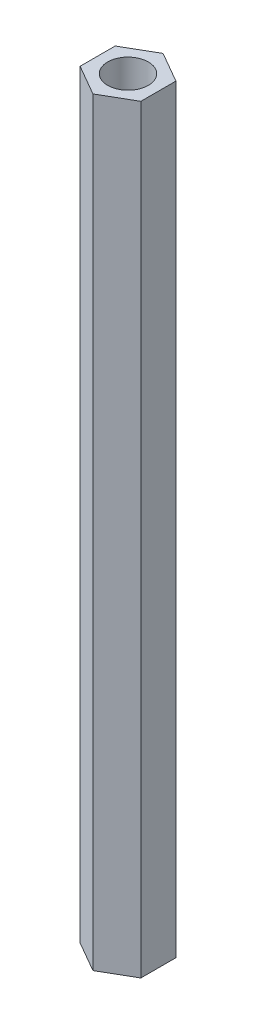
ISO-10303-21;
HEADER;
FILE_DESCRIPTION(('STEP AP214'),'2;1');
FILE_NAME('part.step','',(''),(''),'','','');
FILE_SCHEMA(('AUTOMOTIVE_DESIGN { 1 0 10303 214 1 1 1 1 }'));
ENDSEC;
DATA;
#1=APPLICATION_CONTEXT('core data for automotive mechanical design processes');
#2=APPLICATION_PROTOCOL_DEFINITION('international standard','automotive_design',2000,#1);
#3=PRODUCT_CONTEXT('',#1,'mechanical');
#4=PRODUCT('Part','Part','',(#3));
#5=PRODUCT_RELATED_PRODUCT_CATEGORY('part','',(#4));
#6=PRODUCT_DEFINITION_FORMATION('','',#4);
#7=PRODUCT_DEFINITION_CONTEXT('part definition',#1,'design');
#8=PRODUCT_DEFINITION('design','',#6,#7);
#9=PRODUCT_DEFINITION_SHAPE('','',#8);
#10=(LENGTH_UNIT() NAMED_UNIT(*) SI_UNIT(.MILLI.,.METRE.));
#11=(NAMED_UNIT(*) PLANE_ANGLE_UNIT() SI_UNIT($,.RADIAN.));
#12=(NAMED_UNIT(*) SI_UNIT($,.STERADIAN.) SOLID_ANGLE_UNIT());
#13=UNCERTAINTY_MEASURE_WITH_UNIT(LENGTH_MEASURE(1.E-05),#10,'distance_accuracy_value','');
#14=(GEOMETRIC_REPRESENTATION_CONTEXT(3) GLOBAL_UNCERTAINTY_ASSIGNED_CONTEXT((#13)) GLOBAL_UNIT_ASSIGNED_CONTEXT((#10,
#11,#12)) REPRESENTATION_CONTEXT('',''));
#15=CARTESIAN_POINT('',(0.,0.,0.));
#16=DIRECTION('',(0.,0.,1.));
#17=DIRECTION('',(1.,0.,0.));
#18=AXIS2_PLACEMENT_3D('',#15,#16,#17);
#19=CARTESIAN_POINT('',(0.,44.45,0.));
#20=DIRECTION('',(0.,1.,0.));
#21=DIRECTION('',(0.,0.,1.));
#22=AXIS2_PLACEMENT_3D('',#19,#20,#21);
#23=PLANE('',#22);
#24=DIRECTION('',(0.866025403784438,0.,0.5));
#25=VECTOR('',#24,1.);
#26=CARTESIAN_POINT('',(-1.778,44.45,1.02652877861915));
#27=LINE('',#26,#25);
#28=CARTESIAN_POINT('',(-1.778,44.45,1.02652877861915));
#29=VERTEX_POINT('',#28);
#30=CARTESIAN_POINT('',(0.,44.45,2.05305755723831));
#31=VERTEX_POINT('',#30);
#32=EDGE_CURVE('E129',#29,#31,#27,.T.);
#33=ORIENTED_EDGE('',*,*,#32,.T.);
#34=DIRECTION('',(0.866025403784439,0.,-0.5));
#35=VECTOR('',#34,1.);
#36=CARTESIAN_POINT('',(0.,44.45,2.05305755723831));
#37=LINE('',#36,#35);
#38=CARTESIAN_POINT('',(1.778,44.45,1.02652877861915));
#39=VERTEX_POINT('',#38);
#40=EDGE_CURVE('E87',#31,#39,#37,.T.);
#41=ORIENTED_EDGE('',*,*,#40,.T.);
#42=DIRECTION('',(0.,0.,-1.));
#43=VECTOR('',#42,1.);
#44=CARTESIAN_POINT('',(1.778,44.45,1.02652877861915));
#45=LINE('',#44,#43);
#46=CARTESIAN_POINT('',(1.778,44.45,-1.02652877861915));
#47=VERTEX_POINT('',#46);
#48=EDGE_CURVE('E100',#39,#47,#45,.T.);
#49=ORIENTED_EDGE('',*,*,#48,.T.);
#50=DIRECTION('',(-0.866025403784439,0.,-0.5));
#51=VECTOR('',#50,1.);
#52=CARTESIAN_POINT('',(1.778,44.45,-1.02652877861915));
#53=LINE('',#52,#51);
#54=CARTESIAN_POINT('',(0.,44.45,-2.05305755723831));
#55=VERTEX_POINT('',#54);
#56=EDGE_CURVE('E94',#47,#55,#53,.T.);
#57=ORIENTED_EDGE('',*,*,#56,.T.);
#58=DIRECTION('',(-0.866025403784439,0.,0.5));
#59=VECTOR('',#58,1.);
#60=CARTESIAN_POINT('',(0.,44.45,-2.05305755723831));
#61=LINE('',#60,#59);
#62=CARTESIAN_POINT('',(-1.778,44.45,-1.02652877861915));
#63=VERTEX_POINT('',#62);
#64=EDGE_CURVE('E98',#55,#63,#61,.T.);
#65=ORIENTED_EDGE('',*,*,#64,.T.);
#66=DIRECTION('',(0.,0.,1.));
#67=VECTOR('',#66,1.);
#68=CARTESIAN_POINT('',(-1.778,44.45,-1.02652877861915));
#69=LINE('',#68,#67);
#70=EDGE_CURVE('E50',#63,#29,#69,.T.);
#71=ORIENTED_EDGE('',*,*,#70,.T.);
#72=EDGE_LOOP('',(#33,#41,#49,#57,#65,#71));
#73=FACE_BOUND('',#72,.T.);
#74=CARTESIAN_POINT('',(0.,44.45,0.));
#75=DIRECTION('',(0.,1.,0.));
#76=DIRECTION('',(0.,0.,1.));
#77=AXIS2_PLACEMENT_3D('',#74,#75,#76);
#78=CIRCLE('',#77,1.190625);
#79=CARTESIAN_POINT('',(0.,44.45,1.190625));
#80=VERTEX_POINT('',#79);
#81=EDGE_CURVE('E122',#80,#80,#78,.T.);
#82=ORIENTED_EDGE('',*,*,#81,.F.);
#83=EDGE_LOOP('',(#82));
#84=FACE_BOUND('',#83,.T.);
#85=ADVANCED_FACE('F33',(#73,#84),#23,.T.);
#86=CARTESIAN_POINT('',(0.,0.,0.));
#87=DIRECTION('',(0.,1.,0.));
#88=DIRECTION('',(0.,0.,1.));
#89=AXIS2_PLACEMENT_3D('',#86,#87,#88);
#90=PLANE('',#89);
#91=DIRECTION('',(0.866025403784438,0.,0.5));
#92=VECTOR('',#91,1.);
#93=CARTESIAN_POINT('',(-1.778,0.,1.02652877861915));
#94=LINE('',#93,#92);
#95=CARTESIAN_POINT('',(-1.778,0.,1.02652877861915));
#96=VERTEX_POINT('',#95);
#97=CARTESIAN_POINT('',(0.,0.,2.05305755723831));
#98=VERTEX_POINT('',#97);
#99=EDGE_CURVE('E118',#96,#98,#94,.T.);
#100=ORIENTED_EDGE('',*,*,#99,.F.);
#101=DIRECTION('',(0.,0.,1.));
#102=VECTOR('',#101,1.);
#103=CARTESIAN_POINT('',(-1.778,0.,-1.02652877861915));
#104=LINE('',#103,#102);
#105=CARTESIAN_POINT('',(-1.778,0.,-1.02652877861915));
#106=VERTEX_POINT('',#105);
#107=EDGE_CURVE('E79',#106,#96,#104,.T.);
#108=ORIENTED_EDGE('',*,*,#107,.F.);
#109=DIRECTION('',(-0.866025403784439,0.,0.5));
#110=VECTOR('',#109,1.);
#111=CARTESIAN_POINT('',(0.,0.,-2.05305755723831));
#112=LINE('',#111,#110);
#113=CARTESIAN_POINT('',(0.,0.,-2.05305755723831));
#114=VERTEX_POINT('',#113);
#115=EDGE_CURVE('E73',#114,#106,#112,.T.);
#116=ORIENTED_EDGE('',*,*,#115,.F.);
#117=DIRECTION('',(-0.866025403784439,0.,-0.5));
#118=VECTOR('',#117,1.);
#119=CARTESIAN_POINT('',(1.778,0.,-1.02652877861915));
#120=LINE('',#119,#118);
#121=CARTESIAN_POINT('',(1.778,0.,-1.02652877861915));
#122=VERTEX_POINT('',#121);
#123=EDGE_CURVE('E108',#122,#114,#120,.T.);
#124=ORIENTED_EDGE('',*,*,#123,.F.);
#125=DIRECTION('',(0.,0.,-1.));
#126=VECTOR('',#125,1.);
#127=CARTESIAN_POINT('',(1.778,0.,1.02652877861915));
#128=LINE('',#127,#126);
#129=CARTESIAN_POINT('',(1.778,0.,1.02652877861915));
#130=VERTEX_POINT('',#129);
#131=EDGE_CURVE('E124',#130,#122,#128,.T.);
#132=ORIENTED_EDGE('',*,*,#131,.F.);
#133=DIRECTION('',(0.866025403784439,0.,-0.5));
#134=VECTOR('',#133,1.);
#135=CARTESIAN_POINT('',(0.,0.,2.05305755723831));
#136=LINE('',#135,#134);
#137=EDGE_CURVE('E121',#98,#130,#136,.T.);
#138=ORIENTED_EDGE('',*,*,#137,.F.);
#139=EDGE_LOOP('',(#100,#108,#116,#124,#132,#138));
#140=FACE_BOUND('',#139,.T.);
#141=CARTESIAN_POINT('',(0.,0.,0.));
#142=DIRECTION('',(0.,1.,0.));
#143=DIRECTION('',(0.,0.,1.));
#144=AXIS2_PLACEMENT_3D('',#141,#142,#143);
#145=CIRCLE('',#144,1.190625);
#146=CARTESIAN_POINT('',(0.,0.,1.190625));
#147=VERTEX_POINT('',#146);
#148=EDGE_CURVE('E222',#147,#147,#145,.T.);
#149=ORIENTED_EDGE('',*,*,#148,.T.);
#150=EDGE_LOOP('',(#149));
#151=FACE_BOUND('',#150,.T.);
#152=ADVANCED_FACE('F138',(#140,#151),#90,.F.);
#153=CARTESIAN_POINT('',(-1.778,44.45,1.02652877861915));
#154=DIRECTION('',(0.5,0.,-0.866025403784439));
#155=DIRECTION('',(-0.866025403784439,0.,-0.5));
#156=AXIS2_PLACEMENT_3D('',#153,#154,#155);
#157=PLANE('',#156);
#158=ORIENTED_EDGE('',*,*,#99,.T.);
#159=DIRECTION('',(0.,-1.,0.));
#160=VECTOR('',#159,1.);
#161=CARTESIAN_POINT('',(0.,44.45,2.05305755723831));
#162=LINE('',#161,#160);
#163=EDGE_CURVE('E11',#31,#98,#162,.T.);
#164=ORIENTED_EDGE('',*,*,#163,.F.);
#165=ORIENTED_EDGE('',*,*,#32,.F.);
#166=DIRECTION('',(0.,-1.,0.));
#167=VECTOR('',#166,1.);
#168=CARTESIAN_POINT('',(-1.778,44.45,1.02652877861915));
#169=LINE('',#168,#167);
#170=EDGE_CURVE('E114',#29,#96,#169,.T.);
#171=ORIENTED_EDGE('',*,*,#170,.T.);
#172=EDGE_LOOP('',(#158,#164,#165,#171));
#173=FACE_BOUND('',#172,.T.);
#174=ADVANCED_FACE('F35',(#173),#157,.F.);
#175=CARTESIAN_POINT('',(0.,44.45,2.05305755723831));
#176=DIRECTION('',(-0.5,0.,-0.866025403784439));
#177=DIRECTION('',(-0.866025403784439,0.,0.5));
#178=AXIS2_PLACEMENT_3D('',#175,#176,#177);
#179=PLANE('',#178);
#180=ORIENTED_EDGE('',*,*,#137,.T.);
#181=DIRECTION('',(0.,-1.,0.));
#182=VECTOR('',#181,1.);
#183=CARTESIAN_POINT('',(1.778,44.45,1.02652877861915));
#184=LINE('',#183,#182);
#185=EDGE_CURVE('E42',#39,#130,#184,.T.);
#186=ORIENTED_EDGE('',*,*,#185,.F.);
#187=ORIENTED_EDGE('',*,*,#40,.F.);
#188=ORIENTED_EDGE('',*,*,#163,.T.);
#189=EDGE_LOOP('',(#180,#186,#187,#188));
#190=FACE_BOUND('',#189,.T.);
#191=ADVANCED_FACE('F163',(#190),#179,.F.);
#192=CARTESIAN_POINT('',(1.778,44.45,1.02652877861915));
#193=DIRECTION('',(-1.,0.,0.));
#194=DIRECTION('',(0.,0.,1.));
#195=AXIS2_PLACEMENT_3D('',#192,#193,#194);
#196=PLANE('',#195);
#197=ORIENTED_EDGE('',*,*,#131,.T.);
#198=DIRECTION('',(0.,-1.,0.));
#199=VECTOR('',#198,1.);
#200=CARTESIAN_POINT('',(1.778,44.45,-1.02652877861915));
#201=LINE('',#200,#199);
#202=EDGE_CURVE('E109',#47,#122,#201,.T.);
#203=ORIENTED_EDGE('',*,*,#202,.F.);
#204=ORIENTED_EDGE('',*,*,#48,.F.);
#205=ORIENTED_EDGE('',*,*,#185,.T.);
#206=EDGE_LOOP('',(#197,#203,#204,#205));
#207=FACE_BOUND('',#206,.T.);
#208=ADVANCED_FACE('F135',(#207),#196,.F.);
#209=CARTESIAN_POINT('',(1.778,44.45,-1.02652877861915));
#210=DIRECTION('',(-0.5,0.,0.866025403784439));
#211=DIRECTION('',(0.866025403784439,0.,0.5));
#212=AXIS2_PLACEMENT_3D('',#209,#210,#211);
#213=PLANE('',#212);
#214=ORIENTED_EDGE('',*,*,#123,.T.);
#215=DIRECTION('',(0.,-1.,0.));
#216=VECTOR('',#215,1.);
#217=CARTESIAN_POINT('',(0.,44.45,-2.05305755723831));
#218=LINE('',#217,#216);
#219=EDGE_CURVE('E105',#55,#114,#218,.T.);
#220=ORIENTED_EDGE('',*,*,#219,.F.);
#221=ORIENTED_EDGE('',*,*,#56,.F.);
#222=ORIENTED_EDGE('',*,*,#202,.T.);
#223=EDGE_LOOP('',(#214,#220,#221,#222));
#224=FACE_BOUND('',#223,.T.);
#225=ADVANCED_FACE('F106',(#224),#213,.F.);
#226=CARTESIAN_POINT('',(0.,44.45,-2.05305755723831));
#227=DIRECTION('',(0.5,0.,0.866025403784439));
#228=DIRECTION('',(0.866025403784439,0.,-0.5));
#229=AXIS2_PLACEMENT_3D('',#226,#227,#228);
#230=PLANE('',#229);
#231=ORIENTED_EDGE('',*,*,#115,.T.);
#232=DIRECTION('',(0.,-1.,0.));
#233=VECTOR('',#232,1.);
#234=CARTESIAN_POINT('',(-1.778,44.45,-1.02652877861915));
#235=LINE('',#234,#233);
#236=EDGE_CURVE('E110',#63,#106,#235,.T.);
#237=ORIENTED_EDGE('',*,*,#236,.F.);
#238=ORIENTED_EDGE('',*,*,#64,.F.);
#239=ORIENTED_EDGE('',*,*,#219,.T.);
#240=EDGE_LOOP('',(#231,#237,#238,#239));
#241=FACE_BOUND('',#240,.T.);
#242=ADVANCED_FACE('F112',(#241),#230,.F.);
#243=CARTESIAN_POINT('',(-1.778,44.45,-1.02652877861915));
#244=DIRECTION('',(1.,0.,0.));
#245=DIRECTION('',(0.,0.,-1.));
#246=AXIS2_PLACEMENT_3D('',#243,#244,#245);
#247=PLANE('',#246);
#248=ORIENTED_EDGE('',*,*,#107,.T.);
#249=ORIENTED_EDGE('',*,*,#170,.F.);
#250=ORIENTED_EDGE('',*,*,#70,.F.);
#251=ORIENTED_EDGE('',*,*,#236,.T.);
#252=EDGE_LOOP('',(#248,#249,#250,#251));
#253=FACE_BOUND('',#252,.T.);
#254=ADVANCED_FACE('F143',(#253),#247,.F.);
#255=CARTESIAN_POINT('',(0.,44.45,0.));
#256=DIRECTION('',(0.,-1.,0.));
#257=DIRECTION('',(0.,0.,-1.));
#258=AXIS2_PLACEMENT_3D('',#255,#256,#257);
#259=CYLINDRICAL_SURFACE('',#258,1.190625);
#260=ORIENTED_EDGE('',*,*,#81,.T.);
#261=EDGE_LOOP('',(#260));
#262=FACE_BOUND('',#261,.T.);
#263=ORIENTED_EDGE('',*,*,#148,.F.);
#264=EDGE_LOOP('',(#263));
#265=FACE_BOUND('',#264,.T.);
#266=ADVANCED_FACE('F145',(#262,#265),#259,.F.);
#267=CLOSED_SHELL('',(#85,#152,#174,#191,#208,#225,#242,#254,#266));
#268=MANIFOLD_SOLID_BREP('B2',#267);
#269=ADVANCED_BREP_SHAPE_REPRESENTATION('',(#18,#268),#14);
#270=SHAPE_DEFINITION_REPRESENTATION(#9,#269);
ENDSEC;
END-ISO-10303-21;
